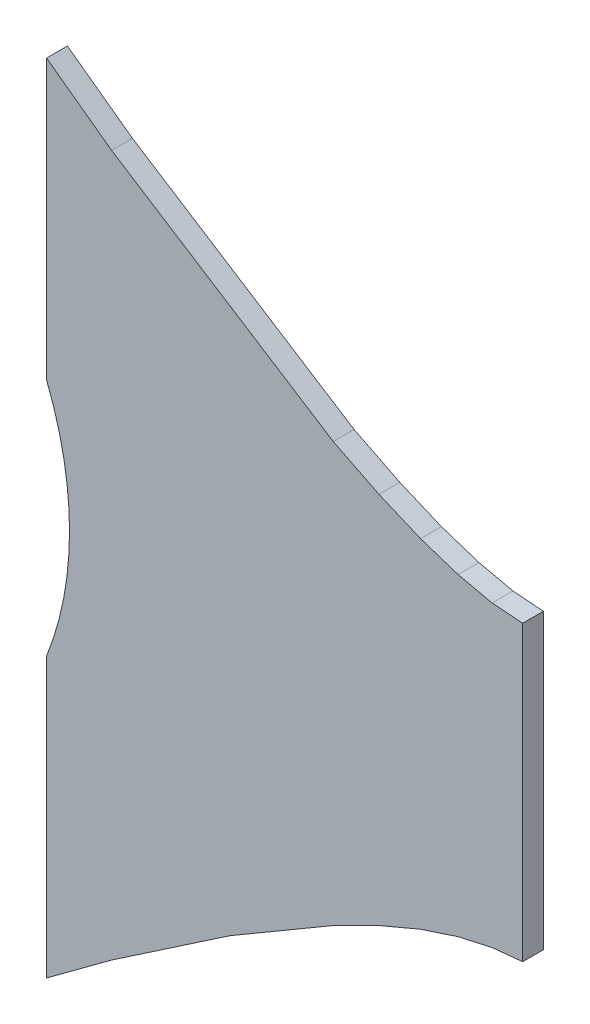
ISO-10303-21;
HEADER;
FILE_DESCRIPTION(('STEP AP214'),'2;1');
FILE_NAME('part.step','',(''),(''),'','','');
FILE_SCHEMA(('AUTOMOTIVE_DESIGN { 1 0 10303 214 1 1 1 1 }'));
ENDSEC;
DATA;
#1=APPLICATION_CONTEXT('core data for automotive mechanical design processes');
#2=APPLICATION_PROTOCOL_DEFINITION('international standard','automotive_design',2000,#1);
#3=PRODUCT_CONTEXT('',#1,'mechanical');
#4=PRODUCT('Part','Part','',(#3));
#5=PRODUCT_RELATED_PRODUCT_CATEGORY('part','',(#4));
#6=PRODUCT_DEFINITION_FORMATION('','',#4);
#7=PRODUCT_DEFINITION_CONTEXT('part definition',#1,'design');
#8=PRODUCT_DEFINITION('design','',#6,#7);
#9=PRODUCT_DEFINITION_SHAPE('','',#8);
#10=(LENGTH_UNIT() NAMED_UNIT(*) SI_UNIT(.MILLI.,.METRE.));
#11=(NAMED_UNIT(*) PLANE_ANGLE_UNIT() SI_UNIT($,.RADIAN.));
#12=(NAMED_UNIT(*) SI_UNIT($,.STERADIAN.) SOLID_ANGLE_UNIT());
#13=UNCERTAINTY_MEASURE_WITH_UNIT(LENGTH_MEASURE(1.E-05),#10,'distance_accuracy_value','');
#14=(GEOMETRIC_REPRESENTATION_CONTEXT(3) GLOBAL_UNCERTAINTY_ASSIGNED_CONTEXT((#13)) GLOBAL_UNIT_ASSIGNED_CONTEXT((#10,
#11,#12)) REPRESENTATION_CONTEXT('',''));
#15=CARTESIAN_POINT('',(0.,0.,0.));
#16=DIRECTION('',(0.,0.,1.));
#17=DIRECTION('',(1.,0.,0.));
#18=AXIS2_PLACEMENT_3D('',#15,#16,#17);
#19=CARTESIAN_POINT('',(98.0270004272461,65.9869995117188,0.));
#20=DIRECTION('',(-1.,0.,0.));
#21=DIRECTION('',(0.,1.,0.));
#22=AXIS2_PLACEMENT_3D('',#19,#20,#21);
#23=PLANE('',#22);
#24=DIRECTION('',(0.,1.,0.));
#25=VECTOR('',#24,1.);
#26=CARTESIAN_POINT('',(98.0270004272461,65.9869995117188,0.03556));
#27=LINE('',#26,#25);
#28=CARTESIAN_POINT('',(98.0270004272461,65.9869995117188,0.03556));
#29=VERTEX_POINT('',#28);
#30=CARTESIAN_POINT('',(98.0270004272461,66.4869995117188,0.03556));
#31=VERTEX_POINT('',#30);
#32=EDGE_CURVE('E11',#29,#31,#27,.T.);
#33=ORIENTED_EDGE('',*,*,#32,.F.);
#34=DIRECTION('',(0.,0.,1.));
#35=VECTOR('',#34,1.);
#36=CARTESIAN_POINT('',(98.0270004272461,65.9869995117188,0.));
#37=LINE('',#36,#35);
#38=CARTESIAN_POINT('',(98.0270004272461,65.9869995117188,0.));
#39=VERTEX_POINT('',#38);
#40=EDGE_CURVE('E24',#39,#29,#37,.T.);
#41=ORIENTED_EDGE('',*,*,#40,.F.);
#42=DIRECTION('',(0.,1.,0.));
#43=VECTOR('',#42,1.);
#44=CARTESIAN_POINT('',(98.0270004272461,65.9869995117188,0.));
#45=LINE('',#44,#43);
#46=CARTESIAN_POINT('',(98.0270004272461,66.4869995117188,0.));
#47=VERTEX_POINT('',#46);
#48=EDGE_CURVE('E309',#39,#47,#45,.T.);
#49=ORIENTED_EDGE('',*,*,#48,.T.);
#50=DIRECTION('',(0.,0.,1.));
#51=VECTOR('',#50,1.);
#52=CARTESIAN_POINT('',(98.0270004272461,66.4869995117188,0.));
#53=LINE('',#52,#51);
#54=EDGE_CURVE('E37',#47,#31,#53,.T.);
#55=ORIENTED_EDGE('',*,*,#54,.T.);
#56=EDGE_LOOP('',(#33,#41,#49,#55));
#57=FACE_BOUND('',#56,.T.);
#58=ADVANCED_FACE('F17',(#57),#23,.F.);
#59=CARTESIAN_POINT('',(97.9749984741211,65.9820022583008,0.));
#60=DIRECTION('',(-0.0956567515017381,0.995414378986025,0.));
#61=DIRECTION('',(0.995414378986025,0.0956567515017381,0.));
#62=AXIS2_PLACEMENT_3D('',#59,#60,#61);
#63=PLANE('',#62);
#64=DIRECTION('',(0.995414378986025,0.0956567515017381,0.));
#65=VECTOR('',#64,1.);
#66=CARTESIAN_POINT('',(97.9749984741211,65.9820022583008,0.03556));
#67=LINE('',#66,#65);
#68=CARTESIAN_POINT('',(97.9749984741211,65.9820022583008,0.03556));
#69=VERTEX_POINT('',#68);
#70=EDGE_CURVE('E305',#69,#29,#67,.T.);
#71=ORIENTED_EDGE('',*,*,#70,.F.);
#72=DIRECTION('',(0.,0.,1.));
#73=VECTOR('',#72,1.);
#74=CARTESIAN_POINT('',(97.9749984741211,65.9820022583008,0.));
#75=LINE('',#74,#73);
#76=CARTESIAN_POINT('',(97.9749984741211,65.9820022583008,0.));
#77=VERTEX_POINT('',#76);
#78=EDGE_CURVE('E303',#77,#69,#75,.T.);
#79=ORIENTED_EDGE('',*,*,#78,.F.);
#80=DIRECTION('',(0.995414378986025,0.0956567515017381,0.));
#81=VECTOR('',#80,1.);
#82=CARTESIAN_POINT('',(97.9749984741211,65.9820022583008,0.));
#83=LINE('',#82,#81);
#84=EDGE_CURVE('E301',#77,#39,#83,.T.);
#85=ORIENTED_EDGE('',*,*,#84,.T.);
#86=ORIENTED_EDGE('',*,*,#40,.T.);
#87=EDGE_LOOP('',(#71,#79,#85,#86));
#88=FACE_BOUND('',#87,.T.);
#89=ADVANCED_FACE('F312',(#88),#63,.F.);
#90=CARTESIAN_POINT('',(97.9169998168945,65.9690017700195,0.));
#91=DIRECTION('',(-0.218724100263412,0.97578674307656,0.));
#92=DIRECTION('',(0.97578674307656,0.218724100263412,0.));
#93=AXIS2_PLACEMENT_3D('',#90,#91,#92);
#94=PLANE('',#93);
#95=DIRECTION('',(0.97578674307656,0.218724100263412,0.));
#96=VECTOR('',#95,1.);
#97=CARTESIAN_POINT('',(97.9169998168945,65.9690017700195,0.03556));
#98=LINE('',#97,#96);
#99=CARTESIAN_POINT('',(97.9169998168945,65.9690017700195,0.03556));
#100=VERTEX_POINT('',#99);
#101=EDGE_CURVE('E298',#100,#69,#98,.T.);
#102=ORIENTED_EDGE('',*,*,#101,.F.);
#103=DIRECTION('',(0.,0.,1.));
#104=VECTOR('',#103,1.);
#105=CARTESIAN_POINT('',(97.9169998168945,65.9690017700195,0.));
#106=LINE('',#105,#104);
#107=CARTESIAN_POINT('',(97.9169998168945,65.9690017700195,0.));
#108=VERTEX_POINT('',#107);
#109=EDGE_CURVE('E296',#108,#100,#106,.T.);
#110=ORIENTED_EDGE('',*,*,#109,.F.);
#111=DIRECTION('',(0.97578674307656,0.218724100263412,0.));
#112=VECTOR('',#111,1.);
#113=CARTESIAN_POINT('',(97.9169998168945,65.9690017700195,0.));
#114=LINE('',#113,#112);
#115=EDGE_CURVE('E293',#108,#77,#114,.T.);
#116=ORIENTED_EDGE('',*,*,#115,.T.);
#117=ORIENTED_EDGE('',*,*,#78,.T.);
#118=EDGE_LOOP('',(#102,#110,#116,#117));
#119=FACE_BOUND('',#118,.T.);
#120=ADVANCED_FACE('F315',(#119),#94,.F.);
#121=CARTESIAN_POINT('',(97.8529968261719,65.947998046875,0.));
#122=DIRECTION('',(-0.311807164411988,0.95014540583079,0.));
#123=DIRECTION('',(0.95014540583079,0.311807164411988,0.));
#124=AXIS2_PLACEMENT_3D('',#121,#122,#123);
#125=PLANE('',#124);
#126=DIRECTION('',(0.95014540583079,0.311807164411988,0.));
#127=VECTOR('',#126,1.);
#128=CARTESIAN_POINT('',(97.8529968261719,65.947998046875,0.03556));
#129=LINE('',#128,#127);
#130=CARTESIAN_POINT('',(97.8529968261719,65.947998046875,0.03556));
#131=VERTEX_POINT('',#130);
#132=EDGE_CURVE('E290',#131,#100,#129,.T.);
#133=ORIENTED_EDGE('',*,*,#132,.F.);
#134=DIRECTION('',(0.,0.,1.));
#135=VECTOR('',#134,1.);
#136=CARTESIAN_POINT('',(97.8529968261719,65.947998046875,0.));
#137=LINE('',#136,#135);
#138=CARTESIAN_POINT('',(97.8529968261719,65.947998046875,0.));
#139=VERTEX_POINT('',#138);
#140=EDGE_CURVE('E288',#139,#131,#137,.T.);
#141=ORIENTED_EDGE('',*,*,#140,.F.);
#142=DIRECTION('',(0.95014540583079,0.311807164411988,0.));
#143=VECTOR('',#142,1.);
#144=CARTESIAN_POINT('',(97.8529968261719,65.947998046875,0.));
#145=LINE('',#144,#143);
#146=EDGE_CURVE('E285',#139,#108,#145,.T.);
#147=ORIENTED_EDGE('',*,*,#146,.T.);
#148=ORIENTED_EDGE('',*,*,#109,.T.);
#149=EDGE_LOOP('',(#133,#141,#147,#148));
#150=FACE_BOUND('',#149,.T.);
#151=ADVANCED_FACE('F320',(#150),#125,.F.);
#152=CARTESIAN_POINT('',(97.7819976806641,65.9179992675781,0.));
#153=DIRECTION('',(-0.389207247493552,0.921150214947862,0.));
#154=DIRECTION('',(0.921150214947862,0.389207247493552,0.));
#155=AXIS2_PLACEMENT_3D('',#152,#153,#154);
#156=PLANE('',#155);
#157=DIRECTION('',(0.921150214947862,0.389207247493552,0.));
#158=VECTOR('',#157,1.);
#159=CARTESIAN_POINT('',(97.7819976806641,65.9179992675781,0.03556));
#160=LINE('',#159,#158);
#161=CARTESIAN_POINT('',(97.7819976806641,65.9179992675781,0.03556));
#162=VERTEX_POINT('',#161);
#163=EDGE_CURVE('E282',#162,#131,#160,.T.);
#164=ORIENTED_EDGE('',*,*,#163,.F.);
#165=DIRECTION('',(0.,0.,1.));
#166=VECTOR('',#165,1.);
#167=CARTESIAN_POINT('',(97.7819976806641,65.9179992675781,0.));
#168=LINE('',#167,#166);
#169=CARTESIAN_POINT('',(97.7819976806641,65.9179992675781,0.));
#170=VERTEX_POINT('',#169);
#171=EDGE_CURVE('E280',#170,#162,#168,.T.);
#172=ORIENTED_EDGE('',*,*,#171,.F.);
#173=DIRECTION('',(0.921150214947862,0.389207247493552,0.));
#174=VECTOR('',#173,1.);
#175=CARTESIAN_POINT('',(97.7819976806641,65.9179992675781,0.));
#176=LINE('',#175,#174);
#177=EDGE_CURVE('E277',#170,#139,#176,.T.);
#178=ORIENTED_EDGE('',*,*,#177,.T.);
#179=ORIENTED_EDGE('',*,*,#140,.T.);
#180=EDGE_LOOP('',(#164,#172,#178,#179));
#181=FACE_BOUND('',#180,.T.);
#182=ADVANCED_FACE('F323',(#181),#156,.F.);
#183=CARTESIAN_POINT('',(97.7040023803711,65.8789978027344,0.));
#184=DIRECTION('',(-0.447248591135036,0.894409692326579,0.));
#185=DIRECTION('',(0.894409692326579,0.447248591135036,0.));
#186=AXIS2_PLACEMENT_3D('',#183,#184,#185);
#187=PLANE('',#186);
#188=DIRECTION('',(0.894409692326579,0.447248591135036,0.));
#189=VECTOR('',#188,1.);
#190=CARTESIAN_POINT('',(97.7040023803711,65.8789978027344,0.03556));
#191=LINE('',#190,#189);
#192=CARTESIAN_POINT('',(97.7040023803711,65.8789978027344,0.03556));
#193=VERTEX_POINT('',#192);
#194=EDGE_CURVE('E274',#193,#162,#191,.T.);
#195=ORIENTED_EDGE('',*,*,#194,.F.);
#196=DIRECTION('',(0.,0.,1.));
#197=VECTOR('',#196,1.);
#198=CARTESIAN_POINT('',(97.7040023803711,65.8789978027344,0.));
#199=LINE('',#198,#197);
#200=CARTESIAN_POINT('',(97.7040023803711,65.8789978027344,0.));
#201=VERTEX_POINT('',#200);
#202=EDGE_CURVE('E272',#201,#193,#199,.T.);
#203=ORIENTED_EDGE('',*,*,#202,.F.);
#204=DIRECTION('',(0.894409692326579,0.447248591135036,0.));
#205=VECTOR('',#204,1.);
#206=CARTESIAN_POINT('',(97.7040023803711,65.8789978027344,0.));
#207=LINE('',#206,#205);
#208=EDGE_CURVE('E269',#201,#170,#207,.T.);
#209=ORIENTED_EDGE('',*,*,#208,.T.);
#210=ORIENTED_EDGE('',*,*,#171,.T.);
#211=EDGE_LOOP('',(#195,#203,#209,#210));
#212=FACE_BOUND('',#211,.T.);
#213=ADVANCED_FACE('F328',(#212),#187,.F.);
#214=CARTESIAN_POINT('',(97.5279998779297,65.7760009765625,0.));
#215=DIRECTION('',(-0.50507317540555,0.863076524698566,0.));
#216=DIRECTION('',(0.863076524698566,0.50507317540555,0.));
#217=AXIS2_PLACEMENT_3D('',#214,#215,#216);
#218=PLANE('',#217);
#219=DIRECTION('',(0.863076524698566,0.50507317540555,0.));
#220=VECTOR('',#219,1.);
#221=CARTESIAN_POINT('',(97.5279998779297,65.7760009765625,0.03556));
#222=LINE('',#221,#220);
#223=CARTESIAN_POINT('',(97.5279998779297,65.7760009765625,0.03556));
#224=VERTEX_POINT('',#223);
#225=EDGE_CURVE('E266',#224,#193,#222,.T.);
#226=ORIENTED_EDGE('',*,*,#225,.F.);
#227=DIRECTION('',(0.,0.,1.));
#228=VECTOR('',#227,1.);
#229=CARTESIAN_POINT('',(97.5279998779297,65.7760009765625,0.));
#230=LINE('',#229,#228);
#231=CARTESIAN_POINT('',(97.5279998779297,65.7760009765625,0.));
#232=VERTEX_POINT('',#231);
#233=EDGE_CURVE('E264',#232,#224,#230,.T.);
#234=ORIENTED_EDGE('',*,*,#233,.F.);
#235=DIRECTION('',(0.863076524698566,0.50507317540555,0.));
#236=VECTOR('',#235,1.);
#237=CARTESIAN_POINT('',(97.5279998779297,65.7760009765625,0.));
#238=LINE('',#237,#236);
#239=EDGE_CURVE('E261',#232,#201,#238,.T.);
#240=ORIENTED_EDGE('',*,*,#239,.T.);
#241=ORIENTED_EDGE('',*,*,#202,.T.);
#242=EDGE_LOOP('',(#226,#234,#240,#241));
#243=FACE_BOUND('',#242,.T.);
#244=ADVANCED_FACE('F331',(#243),#218,.F.);
#245=CARTESIAN_POINT('',(97.3259963989258,65.6389999389648,0.));
#246=DIRECTION('',(-0.561297310666813,0.827614239267428,0.));
#247=DIRECTION('',(0.827614239267428,0.561297310666813,0.));
#248=AXIS2_PLACEMENT_3D('',#245,#246,#247);
#249=PLANE('',#248);
#250=DIRECTION('',(0.827614239267428,0.561297310666813,0.));
#251=VECTOR('',#250,1.);
#252=CARTESIAN_POINT('',(97.3259963989258,65.6389999389648,0.03556));
#253=LINE('',#252,#251);
#254=CARTESIAN_POINT('',(97.3259963989258,65.6389999389648,0.03556));
#255=VERTEX_POINT('',#254);
#256=EDGE_CURVE('E258',#255,#224,#253,.T.);
#257=ORIENTED_EDGE('',*,*,#256,.F.);
#258=DIRECTION('',(0.,0.,1.));
#259=VECTOR('',#258,1.);
#260=CARTESIAN_POINT('',(97.3259963989258,65.6389999389648,0.));
#261=LINE('',#260,#259);
#262=CARTESIAN_POINT('',(97.3259963989258,65.6389999389648,0.));
#263=VERTEX_POINT('',#262);
#264=EDGE_CURVE('E256',#263,#255,#261,.T.);
#265=ORIENTED_EDGE('',*,*,#264,.F.);
#266=DIRECTION('',(0.827614239267428,0.561297310666813,0.));
#267=VECTOR('',#266,1.);
#268=CARTESIAN_POINT('',(97.3259963989258,65.6389999389648,0.));
#269=LINE('',#268,#267);
#270=EDGE_CURVE('E253',#263,#232,#269,.T.);
#271=ORIENTED_EDGE('',*,*,#270,.T.);
#272=ORIENTED_EDGE('',*,*,#233,.T.);
#273=EDGE_LOOP('',(#257,#265,#271,#272));
#274=FACE_BOUND('',#273,.T.);
#275=ADVANCED_FACE('F336',(#274),#249,.F.);
#276=CARTESIAN_POINT('',(97.2149963378906,65.556999206543,0.));
#277=DIRECTION('',(-0.594190520477867,0.804324328473435,0.));
#278=DIRECTION('',(0.804324328473435,0.594190520477867,0.));
#279=AXIS2_PLACEMENT_3D('',#276,#277,#278);
#280=PLANE('',#279);
#281=DIRECTION('',(0.804324328473435,0.594190520477867,0.));
#282=VECTOR('',#281,1.);
#283=CARTESIAN_POINT('',(97.2149963378906,65.556999206543,0.03556));
#284=LINE('',#283,#282);
#285=CARTESIAN_POINT('',(97.2149963378906,65.556999206543,0.03556));
#286=VERTEX_POINT('',#285);
#287=EDGE_CURVE('E250',#286,#255,#284,.T.);
#288=ORIENTED_EDGE('',*,*,#287,.F.);
#289=DIRECTION('',(0.,0.,1.));
#290=VECTOR('',#289,1.);
#291=CARTESIAN_POINT('',(97.2149963378906,65.556999206543,0.));
#292=LINE('',#291,#290);
#293=CARTESIAN_POINT('',(97.2149963378906,65.556999206543,0.));
#294=VERTEX_POINT('',#293);
#295=EDGE_CURVE('E248',#294,#286,#292,.T.);
#296=ORIENTED_EDGE('',*,*,#295,.F.);
#297=DIRECTION('',(0.804324328473435,0.594190520477867,0.));
#298=VECTOR('',#297,1.);
#299=CARTESIAN_POINT('',(97.2149963378906,65.556999206543,0.));
#300=LINE('',#299,#298);
#301=EDGE_CURVE('E245',#294,#263,#300,.T.);
#302=ORIENTED_EDGE('',*,*,#301,.T.);
#303=ORIENTED_EDGE('',*,*,#264,.T.);
#304=EDGE_LOOP('',(#288,#296,#302,#303));
#305=FACE_BOUND('',#304,.T.);
#306=ADVANCED_FACE('F339',(#305),#280,.F.);
#307=CARTESIAN_POINT('',(97.2149963378906,66.0328458945434,0.));
#308=DIRECTION('',(1.,0.,0.));
#309=DIRECTION('',(0.,-1.,0.));
#310=AXIS2_PLACEMENT_3D('',#307,#308,#309);
#311=PLANE('',#310);
#312=DIRECTION('',(0.,-1.,0.));
#313=VECTOR('',#312,1.);
#314=CARTESIAN_POINT('',(97.2149963378906,66.9160003662109,0.03556));
#315=LINE('',#314,#313);
#316=CARTESIAN_POINT('',(97.2149963378906,66.0328458945434,0.03556));
#317=VERTEX_POINT('',#316);
#318=EDGE_CURVE('E242',#317,#286,#315,.T.);
#319=ORIENTED_EDGE('',*,*,#318,.F.);
#320=DIRECTION('',(0.,0.,1.));
#321=VECTOR('',#320,1.);
#322=CARTESIAN_POINT('',(97.2149963378906,66.0328458945434,0.));
#323=LINE('',#322,#321);
#324=CARTESIAN_POINT('',(97.2149963378906,66.0328458945434,0.));
#325=VERTEX_POINT('',#324);
#326=EDGE_CURVE('E240',#325,#317,#323,.T.);
#327=ORIENTED_EDGE('',*,*,#326,.F.);
#328=DIRECTION('',(0.,-1.,0.));
#329=VECTOR('',#328,1.);
#330=CARTESIAN_POINT('',(97.2149963378906,66.9160003662109,0.));
#331=LINE('',#330,#329);
#332=EDGE_CURVE('E237',#325,#294,#331,.T.);
#333=ORIENTED_EDGE('',*,*,#332,.T.);
#334=ORIENTED_EDGE('',*,*,#295,.T.);
#335=EDGE_LOOP('',(#319,#327,#333,#334));
#336=FACE_BOUND('',#335,.T.);
#337=ADVANCED_FACE('F344',(#336),#311,.F.);
#338=CARTESIAN_POINT('',(96.70415,66.2366468,0.));
#339=DIRECTION('',(0.,0.,-1.));
#340=DIRECTION('',(1.,0.,0.));
#341=AXIS2_PLACEMENT_3D('',#338,#339,#340);
#342=CYLINDRICAL_SURFACE('',#341,0.5499989);
#343=ORIENTED_EDGE('',*,*,#326,.T.);
#344=CARTESIAN_POINT('',(96.70415,66.2366468,0.03556));
#345=DIRECTION('',(0.,0.,1.));
#346=DIRECTION('',(1.,0.,0.));
#347=AXIS2_PLACEMENT_3D('',#344,#345,#346);
#348=CIRCLE('',#347,0.5499989);
#349=CARTESIAN_POINT('',(97.2541489,66.2366468,0.03556));
#350=VERTEX_POINT('',#349);
#351=EDGE_CURVE('E234',#317,#350,#348,.T.);
#352=ORIENTED_EDGE('',*,*,#351,.T.);
#353=DIRECTION('',(0.,0.,1.));
#354=VECTOR('',#353,1.);
#355=CARTESIAN_POINT('',(97.2541489,66.2366468,0.));
#356=LINE('',#355,#354);
#357=CARTESIAN_POINT('',(97.2541489,66.2366468,0.));
#358=VERTEX_POINT('',#357);
#359=EDGE_CURVE('E232',#358,#350,#356,.T.);
#360=ORIENTED_EDGE('',*,*,#359,.F.);
#361=CARTESIAN_POINT('',(96.70415,66.2366468,0.));
#362=DIRECTION('',(0.,0.,1.));
#363=DIRECTION('',(1.,0.,0.));
#364=AXIS2_PLACEMENT_3D('',#361,#362,#363);
#365=CIRCLE('',#364,0.5499989);
#366=EDGE_CURVE('E229',#325,#358,#365,.T.);
#367=ORIENTED_EDGE('',*,*,#366,.F.);
#368=EDGE_LOOP('',(#343,#352,#360,#367));
#369=FACE_BOUND('',#368,.T.);
#370=ADVANCED_FACE('F347',(#369),#342,.F.);
#371=CARTESIAN_POINT('',(96.70415,66.2366468,0.));
#372=DIRECTION('',(0.,0.,-1.));
#373=DIRECTION('',(1.,0.,0.));
#374=AXIS2_PLACEMENT_3D('',#371,#372,#373);
#375=CYLINDRICAL_SURFACE('',#374,0.5499989);
#376=ORIENTED_EDGE('',*,*,#359,.T.);
#377=CARTESIAN_POINT('',(96.70415,66.2366468,0.03556));
#378=DIRECTION('',(0.,0.,1.));
#379=DIRECTION('',(1.,0.,0.));
#380=AXIS2_PLACEMENT_3D('',#377,#378,#379);
#381=CIRCLE('',#380,0.5499989);
#382=CARTESIAN_POINT('',(97.2149963378906,66.4404477054566,0.03556));
#383=VERTEX_POINT('',#382);
#384=EDGE_CURVE('E226',#350,#383,#381,.T.);
#385=ORIENTED_EDGE('',*,*,#384,.T.);
#386=DIRECTION('',(0.,0.,1.));
#387=VECTOR('',#386,1.);
#388=CARTESIAN_POINT('',(97.2149963378906,66.4404477054566,0.));
#389=LINE('',#388,#387);
#390=CARTESIAN_POINT('',(97.2149963378906,66.4404477054566,0.));
#391=VERTEX_POINT('',#390);
#392=EDGE_CURVE('E224',#391,#383,#389,.T.);
#393=ORIENTED_EDGE('',*,*,#392,.F.);
#394=EDGE_CURVE('E223',#358,#391,#365,.T.);
#395=ORIENTED_EDGE('',*,*,#394,.F.);
#396=EDGE_LOOP('',(#376,#385,#393,#395));
#397=FACE_BOUND('',#396,.T.);
#398=ADVANCED_FACE('F354',(#397),#375,.F.);
#399=CARTESIAN_POINT('',(97.2149963378906,66.9160003662109,0.));
#400=DIRECTION('',(1.,0.,0.));
#401=DIRECTION('',(0.,-1.,0.));
#402=AXIS2_PLACEMENT_3D('',#399,#400,#401);
#403=PLANE('',#402);
#404=DIRECTION('',(0.,-1.,0.));
#405=VECTOR('',#404,1.);
#406=CARTESIAN_POINT('',(97.2149963378906,66.9160003662109,0.03556));
#407=LINE('',#406,#405);
#408=CARTESIAN_POINT('',(97.2149963378906,66.9160003662109,0.03556));
#409=VERTEX_POINT('',#408);
#410=EDGE_CURVE('E220',#409,#383,#407,.T.);
#411=ORIENTED_EDGE('',*,*,#410,.F.);
#412=DIRECTION('',(0.,0.,1.));
#413=VECTOR('',#412,1.);
#414=CARTESIAN_POINT('',(97.2149963378906,66.9160003662109,0.));
#415=LINE('',#414,#413);
#416=CARTESIAN_POINT('',(97.2149963378906,66.9160003662109,0.));
#417=VERTEX_POINT('',#416);
#418=EDGE_CURVE('E218',#417,#409,#415,.T.);
#419=ORIENTED_EDGE('',*,*,#418,.F.);
#420=EDGE_CURVE('E217',#417,#391,#331,.T.);
#421=ORIENTED_EDGE('',*,*,#420,.T.);
#422=ORIENTED_EDGE('',*,*,#392,.T.);
#423=EDGE_LOOP('',(#411,#419,#421,#422));
#424=FACE_BOUND('',#423,.T.);
#425=ADVANCED_FACE('F357',(#424),#403,.F.);
#426=CARTESIAN_POINT('',(97.3259963989258,66.8349990844727,0.));
#427=DIRECTION('',(-0.589474945086485,-0.807786660644558,0.));
#428=DIRECTION('',(-0.807786660644558,0.589474945086485,0.));
#429=AXIS2_PLACEMENT_3D('',#426,#427,#428);
#430=PLANE('',#429);
#431=DIRECTION('',(-0.807786660644558,0.589474945086485,0.));
#432=VECTOR('',#431,1.);
#433=CARTESIAN_POINT('',(97.3259963989258,66.8349990844727,0.03556));
#434=LINE('',#433,#432);
#435=CARTESIAN_POINT('',(97.3259963989258,66.8349990844727,0.03556));
#436=VERTEX_POINT('',#435);
#437=EDGE_CURVE('E214',#436,#409,#434,.T.);
#438=ORIENTED_EDGE('',*,*,#437,.F.);
#439=DIRECTION('',(0.,0.,1.));
#440=VECTOR('',#439,1.);
#441=CARTESIAN_POINT('',(97.3259963989258,66.8349990844727,0.));
#442=LINE('',#441,#440);
#443=CARTESIAN_POINT('',(97.3259963989258,66.8349990844727,0.));
#444=VERTEX_POINT('',#443);
#445=EDGE_CURVE('E212',#444,#436,#442,.T.);
#446=ORIENTED_EDGE('',*,*,#445,.F.);
#447=DIRECTION('',(-0.807786660644558,0.589474945086485,0.));
#448=VECTOR('',#447,1.);
#449=CARTESIAN_POINT('',(97.3259963989258,66.8349990844727,0.));
#450=LINE('',#449,#448);
#451=EDGE_CURVE('E209',#444,#417,#450,.T.);
#452=ORIENTED_EDGE('',*,*,#451,.T.);
#453=ORIENTED_EDGE('',*,*,#418,.T.);
#454=EDGE_LOOP('',(#438,#446,#452,#453));
#455=FACE_BOUND('',#454,.T.);
#456=ADVANCED_FACE('F362',(#455),#430,.F.);
#457=CARTESIAN_POINT('',(97.7040023803711,66.5940017700195,0.));
#458=DIRECTION('',(-0.53758668297751,-0.843208490401536,0.));
#459=DIRECTION('',(-0.843208490401536,0.53758668297751,0.));
#460=AXIS2_PLACEMENT_3D('',#457,#458,#459);
#461=PLANE('',#460);
#462=DIRECTION('',(-0.843208490401536,0.53758668297751,0.));
#463=VECTOR('',#462,1.);
#464=CARTESIAN_POINT('',(97.7040023803711,66.5940017700195,0.03556));
#465=LINE('',#464,#463);
#466=CARTESIAN_POINT('',(97.7040023803711,66.5940017700195,0.03556));
#467=VERTEX_POINT('',#466);
#468=EDGE_CURVE('E206',#467,#436,#465,.T.);
#469=ORIENTED_EDGE('',*,*,#468,.F.);
#470=DIRECTION('',(0.,0.,1.));
#471=VECTOR('',#470,1.);
#472=CARTESIAN_POINT('',(97.7040023803711,66.5940017700195,0.));
#473=LINE('',#472,#471);
#474=CARTESIAN_POINT('',(97.7040023803711,66.5940017700195,0.));
#475=VERTEX_POINT('',#474);
#476=EDGE_CURVE('E204',#475,#467,#473,.T.);
#477=ORIENTED_EDGE('',*,*,#476,.F.);
#478=DIRECTION('',(-0.843208490401536,0.53758668297751,0.));
#479=VECTOR('',#478,1.);
#480=CARTESIAN_POINT('',(97.7040023803711,66.5940017700195,0.));
#481=LINE('',#480,#479);
#482=EDGE_CURVE('E201',#475,#444,#481,.T.);
#483=ORIENTED_EDGE('',*,*,#482,.T.);
#484=ORIENTED_EDGE('',*,*,#445,.T.);
#485=EDGE_LOOP('',(#469,#477,#483,#484));
#486=FACE_BOUND('',#485,.T.);
#487=ADVANCED_FACE('F365',(#486),#461,.F.);
#488=CARTESIAN_POINT('',(97.7819976806641,66.5550003051758,0.));
#489=DIRECTION('',(-0.447248591135036,-0.894409692326579,0.));
#490=DIRECTION('',(-0.894409692326579,0.447248591135036,0.));
#491=AXIS2_PLACEMENT_3D('',#488,#489,#490);
#492=PLANE('',#491);
#493=DIRECTION('',(-0.894409692326579,0.447248591135036,0.));
#494=VECTOR('',#493,1.);
#495=CARTESIAN_POINT('',(97.7819976806641,66.5550003051758,0.03556));
#496=LINE('',#495,#494);
#497=CARTESIAN_POINT('',(97.7819976806641,66.5550003051758,0.03556));
#498=VERTEX_POINT('',#497);
#499=EDGE_CURVE('E198',#498,#467,#496,.T.);
#500=ORIENTED_EDGE('',*,*,#499,.F.);
#501=DIRECTION('',(0.,0.,1.));
#502=VECTOR('',#501,1.);
#503=CARTESIAN_POINT('',(97.7819976806641,66.5550003051758,0.));
#504=LINE('',#503,#502);
#505=CARTESIAN_POINT('',(97.7819976806641,66.5550003051758,0.));
#506=VERTEX_POINT('',#505);
#507=EDGE_CURVE('E196',#506,#498,#504,.T.);
#508=ORIENTED_EDGE('',*,*,#507,.F.);
#509=DIRECTION('',(-0.894409692326579,0.447248591135036,0.));
#510=VECTOR('',#509,1.);
#511=CARTESIAN_POINT('',(97.7819976806641,66.5550003051758,0.));
#512=LINE('',#511,#510);
#513=EDGE_CURVE('E193',#506,#475,#512,.T.);
#514=ORIENTED_EDGE('',*,*,#513,.T.);
#515=ORIENTED_EDGE('',*,*,#476,.T.);
#516=EDGE_LOOP('',(#500,#508,#514,#515));
#517=FACE_BOUND('',#516,.T.);
#518=ADVANCED_FACE('F369',(#517),#492,.F.);
#519=CARTESIAN_POINT('',(97.8529968261719,66.5250015258789,0.));
#520=DIRECTION('',(-0.389207247493552,-0.921150214947862,0.));
#521=DIRECTION('',(-0.921150214947862,0.389207247493552,0.));
#522=AXIS2_PLACEMENT_3D('',#519,#520,#521);
#523=PLANE('',#522);
#524=DIRECTION('',(-0.921150214947862,0.389207247493552,0.));
#525=VECTOR('',#524,1.);
#526=CARTESIAN_POINT('',(97.8529968261719,66.5250015258789,0.03556));
#527=LINE('',#526,#525);
#528=CARTESIAN_POINT('',(97.8529968261719,66.5250015258789,0.03556));
#529=VERTEX_POINT('',#528);
#530=EDGE_CURVE('E190',#529,#498,#527,.T.);
#531=ORIENTED_EDGE('',*,*,#530,.F.);
#532=DIRECTION('',(0.,0.,1.));
#533=VECTOR('',#532,1.);
#534=CARTESIAN_POINT('',(97.8529968261719,66.5250015258789,0.));
#535=LINE('',#534,#533);
#536=CARTESIAN_POINT('',(97.8529968261719,66.5250015258789,0.));
#537=VERTEX_POINT('',#536);
#538=EDGE_CURVE('E188',#537,#529,#535,.T.);
#539=ORIENTED_EDGE('',*,*,#538,.F.);
#540=DIRECTION('',(-0.921150214947862,0.389207247493552,0.));
#541=VECTOR('',#540,1.);
#542=CARTESIAN_POINT('',(97.8529968261719,66.5250015258789,0.));
#543=LINE('',#542,#541);
#544=EDGE_CURVE('E185',#537,#506,#543,.T.);
#545=ORIENTED_EDGE('',*,*,#544,.T.);
#546=ORIENTED_EDGE('',*,*,#507,.T.);
#547=EDGE_LOOP('',(#531,#539,#545,#546));
#548=FACE_BOUND('',#547,.T.);
#549=ADVANCED_FACE('F372',(#548),#523,.F.);
#550=CARTESIAN_POINT('',(97.9169998168945,66.5039978027344,0.));
#551=DIRECTION('',(-0.311807164411988,-0.95014540583079,0.));
#552=DIRECTION('',(-0.95014540583079,0.311807164411988,0.));
#553=AXIS2_PLACEMENT_3D('',#550,#551,#552);
#554=PLANE('',#553);
#555=DIRECTION('',(-0.95014540583079,0.311807164411988,0.));
#556=VECTOR('',#555,1.);
#557=CARTESIAN_POINT('',(97.9169998168945,66.5039978027344,0.03556));
#558=LINE('',#557,#556);
#559=CARTESIAN_POINT('',(97.9169998168945,66.5039978027344,0.03556));
#560=VERTEX_POINT('',#559);
#561=EDGE_CURVE('E182',#560,#529,#558,.T.);
#562=ORIENTED_EDGE('',*,*,#561,.F.);
#563=DIRECTION('',(0.,0.,1.));
#564=VECTOR('',#563,1.);
#565=CARTESIAN_POINT('',(97.9169998168945,66.5039978027344,0.));
#566=LINE('',#565,#564);
#567=CARTESIAN_POINT('',(97.9169998168945,66.5039978027344,0.));
#568=VERTEX_POINT('',#567);
#569=EDGE_CURVE('E180',#568,#560,#566,.T.);
#570=ORIENTED_EDGE('',*,*,#569,.F.);
#571=DIRECTION('',(-0.95014540583079,0.311807164411988,0.));
#572=VECTOR('',#571,1.);
#573=CARTESIAN_POINT('',(97.9169998168945,66.5039978027344,0.));
#574=LINE('',#573,#572);
#575=EDGE_CURVE('E171',#568,#537,#574,.T.);
#576=ORIENTED_EDGE('',*,*,#575,.T.);
#577=ORIENTED_EDGE('',*,*,#538,.T.);
#578=EDGE_LOOP('',(#562,#570,#576,#577));
#579=FACE_BOUND('',#578,.T.);
#580=ADVANCED_FACE('F375',(#579),#554,.F.);
#581=CARTESIAN_POINT('',(97.9749984741211,66.4909973144531,0.));
#582=DIRECTION('',(-0.218724100263412,-0.97578674307656,0.));
#583=DIRECTION('',(-0.97578674307656,0.218724100263412,0.));
#584=AXIS2_PLACEMENT_3D('',#581,#582,#583);
#585=PLANE('',#584);
#586=DIRECTION('',(-0.97578674307656,0.218724100263412,0.));
#587=VECTOR('',#586,1.);
#588=CARTESIAN_POINT('',(97.9749984741211,66.4909973144531,0.03556));
#589=LINE('',#588,#587);
#590=CARTESIAN_POINT('',(97.9749984741211,66.4909973144531,0.03556));
#591=VERTEX_POINT('',#590);
#592=EDGE_CURVE('E157',#591,#560,#589,.T.);
#593=ORIENTED_EDGE('',*,*,#592,.F.);
#594=DIRECTION('',(0.,0.,1.));
#595=VECTOR('',#594,1.);
#596=CARTESIAN_POINT('',(97.9749984741211,66.4909973144531,0.));
#597=LINE('',#596,#595);
#598=CARTESIAN_POINT('',(97.9749984741211,66.4909973144531,0.));
#599=VERTEX_POINT('',#598);
#600=EDGE_CURVE('E152',#599,#591,#597,.T.);
#601=ORIENTED_EDGE('',*,*,#600,.F.);
#602=DIRECTION('',(-0.97578674307656,0.218724100263412,0.));
#603=VECTOR('',#602,1.);
#604=CARTESIAN_POINT('',(97.9749984741211,66.4909973144531,0.));
#605=LINE('',#604,#603);
#606=EDGE_CURVE('E155',#599,#568,#605,.T.);
#607=ORIENTED_EDGE('',*,*,#606,.T.);
#608=ORIENTED_EDGE('',*,*,#569,.T.);
#609=EDGE_LOOP('',(#593,#601,#607,#608));
#610=FACE_BOUND('',#609,.T.);
#611=ADVANCED_FACE('F154',(#610),#585,.F.);
#612=CARTESIAN_POINT('',(98.0270004272461,66.4869995117188,0.));
#613=DIRECTION('',(-0.07665175373348,-0.997057926426335,0.));
#614=DIRECTION('',(-0.997057926426335,0.07665175373348,0.));
#615=AXIS2_PLACEMENT_3D('',#612,#613,#614);
#616=PLANE('',#615);
#617=DIRECTION('',(-0.997057926426335,0.07665175373348,0.));
#618=VECTOR('',#617,1.);
#619=CARTESIAN_POINT('',(98.0270004272461,66.4869995117188,0.03556));
#620=LINE('',#619,#618);
#621=EDGE_CURVE('E172',#31,#591,#620,.T.);
#622=ORIENTED_EDGE('',*,*,#621,.F.);
#623=ORIENTED_EDGE('',*,*,#54,.F.);
#624=DIRECTION('',(-0.997057926426335,0.07665175373348,0.));
#625=VECTOR('',#624,1.);
#626=CARTESIAN_POINT('',(98.0270004272461,66.4869995117188,0.));
#627=LINE('',#626,#625);
#628=EDGE_CURVE('E168',#47,#599,#627,.T.);
#629=ORIENTED_EDGE('',*,*,#628,.T.);
#630=ORIENTED_EDGE('',*,*,#600,.T.);
#631=EDGE_LOOP('',(#622,#623,#629,#630));
#632=FACE_BOUND('',#631,.T.);
#633=ADVANCED_FACE('F174',(#632),#616,.F.);
#634=CARTESIAN_POINT('',(98.0270004272461,66.4869995117188,0.));
#635=DIRECTION('',(0.,0.,1.));
#636=DIRECTION('',(1.,0.,0.));
#637=AXIS2_PLACEMENT_3D('',#634,#635,#636);
#638=PLANE('',#637);
#639=ORIENTED_EDGE('',*,*,#628,.F.);
#640=ORIENTED_EDGE('',*,*,#48,.F.);
#641=ORIENTED_EDGE('',*,*,#84,.F.);
#642=ORIENTED_EDGE('',*,*,#115,.F.);
#643=ORIENTED_EDGE('',*,*,#146,.F.);
#644=ORIENTED_EDGE('',*,*,#177,.F.);
#645=ORIENTED_EDGE('',*,*,#208,.F.);
#646=ORIENTED_EDGE('',*,*,#239,.F.);
#647=ORIENTED_EDGE('',*,*,#270,.F.);
#648=ORIENTED_EDGE('',*,*,#301,.F.);
#649=ORIENTED_EDGE('',*,*,#332,.F.);
#650=ORIENTED_EDGE('',*,*,#366,.T.);
#651=ORIENTED_EDGE('',*,*,#394,.T.);
#652=ORIENTED_EDGE('',*,*,#420,.F.);
#653=ORIENTED_EDGE('',*,*,#451,.F.);
#654=ORIENTED_EDGE('',*,*,#482,.F.);
#655=ORIENTED_EDGE('',*,*,#513,.F.);
#656=ORIENTED_EDGE('',*,*,#544,.F.);
#657=ORIENTED_EDGE('',*,*,#575,.F.);
#658=ORIENTED_EDGE('',*,*,#606,.F.);
#659=EDGE_LOOP('',(#639,#640,#641,#642,#643,#644,#645,#646,#647,#648,#649,#650,#651,#652,#653,
#654,#655,#656,#657,#658));
#660=FACE_BOUND('',#659,.T.);
#661=ADVANCED_FACE('F166',(#660),#638,.F.);
#662=CARTESIAN_POINT('',(98.0270004272461,66.4869995117188,0.03556));
#663=DIRECTION('',(0.,0.,1.));
#664=DIRECTION('',(1.,0.,0.));
#665=AXIS2_PLACEMENT_3D('',#662,#663,#664);
#666=PLANE('',#665);
#667=ORIENTED_EDGE('',*,*,#32,.T.);
#668=ORIENTED_EDGE('',*,*,#621,.T.);
#669=ORIENTED_EDGE('',*,*,#592,.T.);
#670=ORIENTED_EDGE('',*,*,#561,.T.);
#671=ORIENTED_EDGE('',*,*,#530,.T.);
#672=ORIENTED_EDGE('',*,*,#499,.T.);
#673=ORIENTED_EDGE('',*,*,#468,.T.);
#674=ORIENTED_EDGE('',*,*,#437,.T.);
#675=ORIENTED_EDGE('',*,*,#410,.T.);
#676=ORIENTED_EDGE('',*,*,#384,.F.);
#677=ORIENTED_EDGE('',*,*,#351,.F.);
#678=ORIENTED_EDGE('',*,*,#318,.T.);
#679=ORIENTED_EDGE('',*,*,#287,.T.);
#680=ORIENTED_EDGE('',*,*,#256,.T.);
#681=ORIENTED_EDGE('',*,*,#225,.T.);
#682=ORIENTED_EDGE('',*,*,#194,.T.);
#683=ORIENTED_EDGE('',*,*,#163,.T.);
#684=ORIENTED_EDGE('',*,*,#132,.T.);
#685=ORIENTED_EDGE('',*,*,#101,.T.);
#686=ORIENTED_EDGE('',*,*,#70,.T.);
#687=EDGE_LOOP('',(#667,#668,#669,#670,#671,#672,#673,#674,#675,#676,#677,#678,#679,#680,#681,
#682,#683,#684,#685,#686));
#688=FACE_BOUND('',#687,.T.);
#689=ADVANCED_FACE('F377',(#688),#666,.T.);
#690=CLOSED_SHELL('',(#58,#89,#120,#151,#182,#213,#244,#275,#306,#337,#370,#398,#425,#456,#487,
#518,#549,#580,#611,#633,#661,#689));
#691=MANIFOLD_SOLID_BREP('B1',#690);
#692=ADVANCED_BREP_SHAPE_REPRESENTATION('',(#18,#691),#14);
#693=SHAPE_DEFINITION_REPRESENTATION(#9,#692);
ENDSEC;
END-ISO-10303-21;
